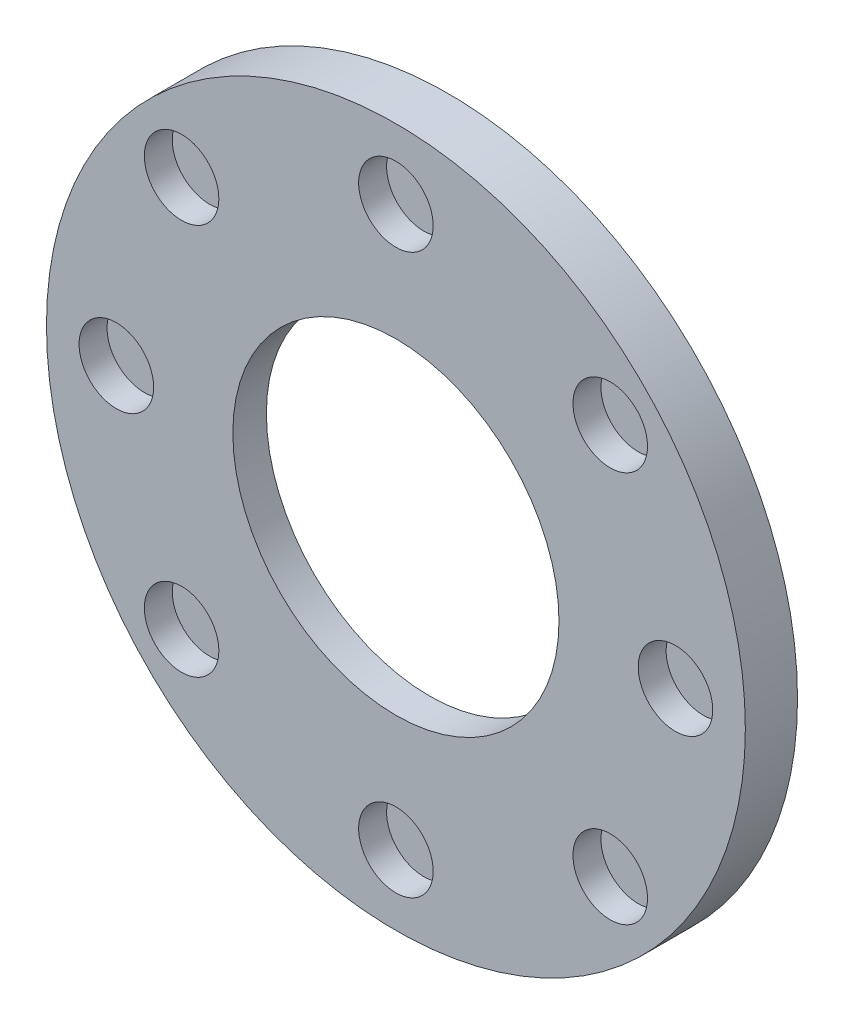
ISO-10303-21;
HEADER;
FILE_DESCRIPTION(('STEP AP214'),'2;1');
FILE_NAME('part.step','',(''),(''),'','','');
FILE_SCHEMA(('AUTOMOTIVE_DESIGN { 1 0 10303 214 1 1 1 1 }'));
ENDSEC;
DATA;
#1=APPLICATION_CONTEXT('core data for automotive mechanical design processes');
#2=APPLICATION_PROTOCOL_DEFINITION('international standard','automotive_design',2000,#1);
#3=PRODUCT_CONTEXT('',#1,'mechanical');
#4=PRODUCT('Part','Part','',(#3));
#5=PRODUCT_RELATED_PRODUCT_CATEGORY('part','',(#4));
#6=PRODUCT_DEFINITION_FORMATION('','',#4);
#7=PRODUCT_DEFINITION_CONTEXT('part definition',#1,'design');
#8=PRODUCT_DEFINITION('design','',#6,#7);
#9=PRODUCT_DEFINITION_SHAPE('','',#8);
#10=(LENGTH_UNIT() NAMED_UNIT(*) SI_UNIT(.MILLI.,.METRE.));
#11=(NAMED_UNIT(*) PLANE_ANGLE_UNIT() SI_UNIT($,.RADIAN.));
#12=(NAMED_UNIT(*) SI_UNIT($,.STERADIAN.) SOLID_ANGLE_UNIT());
#13=UNCERTAINTY_MEASURE_WITH_UNIT(LENGTH_MEASURE(1.E-05),#10,'distance_accuracy_value','');
#14=(GEOMETRIC_REPRESENTATION_CONTEXT(3) GLOBAL_UNCERTAINTY_ASSIGNED_CONTEXT((#13)) GLOBAL_UNIT_ASSIGNED_CONTEXT((#10,
#11,#12)) REPRESENTATION_CONTEXT('',''));
#15=CARTESIAN_POINT('',(0.,0.,0.));
#16=DIRECTION('',(0.,0.,1.));
#17=DIRECTION('',(1.,0.,0.));
#18=AXIS2_PLACEMENT_3D('',#15,#16,#17);
#19=CARTESIAN_POINT('',(0.,0.,0.));
#20=DIRECTION('',(0.,0.,1.));
#21=DIRECTION('',(1.,0.,0.));
#22=AXIS2_PLACEMENT_3D('',#19,#20,#21);
#23=PLANE('',#22);
#24=CARTESIAN_POINT('',(0.,0.,0.));
#25=DIRECTION('',(0.,0.,1.));
#26=DIRECTION('',(1.,0.,0.));
#27=AXIS2_PLACEMENT_3D('',#24,#25,#26);
#28=CIRCLE('',#27,37.5);
#29=CARTESIAN_POINT('',(37.5,0.,0.));
#30=VERTEX_POINT('',#29);
#31=EDGE_CURVE('E10',#30,#30,#28,.T.);
#32=ORIENTED_EDGE('',*,*,#31,.F.);
#33=EDGE_LOOP('',(#32));
#34=FACE_BOUND('',#33,.T.);
#35=CARTESIAN_POINT('',(0.,0.,0.));
#36=DIRECTION('',(0.,0.,1.));
#37=DIRECTION('',(1.,0.,0.));
#38=AXIS2_PLACEMENT_3D('',#35,#36,#37);
#39=CIRCLE('',#38,25.);
#40=CARTESIAN_POINT('',(25.,0.,0.));
#41=VERTEX_POINT('',#40);
#42=EDGE_CURVE('E38',#41,#41,#39,.T.);
#43=ORIENTED_EDGE('',*,*,#42,.T.);
#44=EDGE_LOOP('',(#43));
#45=FACE_BOUND('',#44,.T.);
#46=ADVANCED_FACE('F31',(#34,#45),#23,.F.);
#47=CARTESIAN_POINT('',(0.,0.,2.));
#48=DIRECTION('',(0.,0.,-1.));
#49=DIRECTION('',(-1.,0.,0.));
#50=AXIS2_PLACEMENT_3D('',#47,#48,#49);
#51=CYLINDRICAL_SURFACE('',#50,37.5);
#52=ORIENTED_EDGE('',*,*,#31,.T.);
#53=EDGE_LOOP('',(#52));
#54=FACE_BOUND('',#53,.T.);
#55=CARTESIAN_POINT('',(0.,0.,5.6));
#56=DIRECTION('',(0.,0.,1.));
#57=DIRECTION('',(1.,0.,0.));
#58=AXIS2_PLACEMENT_3D('',#55,#56,#57);
#59=CIRCLE('',#58,37.5);
#60=CARTESIAN_POINT('',(37.5,0.,5.6));
#61=VERTEX_POINT('',#60);
#62=EDGE_CURVE('E51',#61,#61,#59,.T.);
#63=ORIENTED_EDGE('',*,*,#62,.F.);
#64=EDGE_LOOP('',(#63));
#65=FACE_BOUND('',#64,.T.);
#66=ADVANCED_FACE('F33',(#54,#65),#51,.T.);
#67=CARTESIAN_POINT('',(0.,0.,2.));
#68=DIRECTION('',(0.,0.,-1.));
#69=DIRECTION('',(-1.,0.,0.));
#70=AXIS2_PLACEMENT_3D('',#67,#68,#69);
#71=CYLINDRICAL_SURFACE('',#70,25.);
#72=CARTESIAN_POINT('',(0.,0.,2.));
#73=DIRECTION('',(0.,0.,1.));
#74=DIRECTION('',(1.,0.,0.));
#75=AXIS2_PLACEMENT_3D('',#72,#73,#74);
#76=CIRCLE('',#75,25.);
#77=CARTESIAN_POINT('',(25.,0.,2.));
#78=VERTEX_POINT('',#77);
#79=EDGE_CURVE('E42',#78,#78,#76,.T.);
#80=ORIENTED_EDGE('',*,*,#79,.T.);
#81=EDGE_LOOP('',(#80));
#82=FACE_BOUND('',#81,.T.);
#83=ORIENTED_EDGE('',*,*,#42,.F.);
#84=EDGE_LOOP('',(#83));
#85=FACE_BOUND('',#84,.T.);
#86=ADVANCED_FACE('F132',(#82,#85),#71,.F.);
#87=CARTESIAN_POINT('',(0.,0.,2.));
#88=DIRECTION('',(0.,0.,1.));
#89=DIRECTION('',(1.,0.,0.));
#90=AXIS2_PLACEMENT_3D('',#87,#88,#89);
#91=PLANE('',#90);
#92=CARTESIAN_POINT('',(0.,0.,2.));
#93=DIRECTION('',(0.,0.,1.));
#94=DIRECTION('',(1.,0.,0.));
#95=AXIS2_PLACEMENT_3D('',#92,#93,#94);
#96=CIRCLE('',#95,17.5);
#97=CARTESIAN_POINT('',(17.5,0.,2.));
#98=VERTEX_POINT('',#97);
#99=EDGE_CURVE('E46',#98,#98,#96,.T.);
#100=ORIENTED_EDGE('',*,*,#99,.T.);
#101=EDGE_LOOP('',(#100));
#102=FACE_BOUND('',#101,.T.);
#103=ORIENTED_EDGE('',*,*,#79,.F.);
#104=EDGE_LOOP('',(#103));
#105=FACE_BOUND('',#104,.T.);
#106=ADVANCED_FACE('F122',(#102,#105),#91,.F.);
#107=CARTESIAN_POINT('',(0.,0.,2.6));
#108=DIRECTION('',(0.,0.,-1.));
#109=DIRECTION('',(-1.,0.,0.));
#110=AXIS2_PLACEMENT_3D('',#107,#108,#109);
#111=CYLINDRICAL_SURFACE('',#110,17.5);
#112=ORIENTED_EDGE('',*,*,#99,.F.);
#113=EDGE_LOOP('',(#112));
#114=FACE_BOUND('',#113,.T.);
#115=CARTESIAN_POINT('',(0.,0.,5.6));
#116=DIRECTION('',(0.,0.,1.));
#117=DIRECTION('',(1.,0.,0.));
#118=AXIS2_PLACEMENT_3D('',#115,#116,#117);
#119=CIRCLE('',#118,17.5);
#120=CARTESIAN_POINT('',(17.5,0.,5.6));
#121=VERTEX_POINT('',#120);
#122=EDGE_CURVE('E54',#121,#121,#119,.T.);
#123=ORIENTED_EDGE('',*,*,#122,.T.);
#124=EDGE_LOOP('',(#123));
#125=FACE_BOUND('',#124,.T.);
#126=ADVANCED_FACE('F112',(#114,#125),#111,.F.);
#127=CARTESIAN_POINT('',(0.,0.,5.6));
#128=DIRECTION('',(0.,0.,1.));
#129=DIRECTION('',(1.,0.,0.));
#130=AXIS2_PLACEMENT_3D('',#127,#128,#129);
#131=PLANE('',#130);
#132=CARTESIAN_POINT('',(-23.,-21.,5.6));
#133=DIRECTION('',(0.,0.,1.));
#134=DIRECTION('',(1.,0.,0.));
#135=AXIS2_PLACEMENT_3D('',#132,#133,#134);
#136=CIRCLE('',#135,4.);
#137=CARTESIAN_POINT('',(-19.,-21.,5.6));
#138=VERTEX_POINT('',#137);
#139=EDGE_CURVE('E91',#138,#138,#136,.T.);
#140=ORIENTED_EDGE('',*,*,#139,.F.);
#141=EDGE_LOOP('',(#140));
#142=FACE_BOUND('',#141,.T.);
#143=CARTESIAN_POINT('',(23.,21.,5.6));
#144=DIRECTION('',(0.,0.,1.));
#145=DIRECTION('',(1.,0.,0.));
#146=AXIS2_PLACEMENT_3D('',#143,#144,#145);
#147=CIRCLE('',#146,4.);
#148=CARTESIAN_POINT('',(27.,21.,5.6));
#149=VERTEX_POINT('',#148);
#150=EDGE_CURVE('E79',#149,#149,#147,.T.);
#151=ORIENTED_EDGE('',*,*,#150,.F.);
#152=EDGE_LOOP('',(#151));
#153=FACE_BOUND('',#152,.T.);
#154=CARTESIAN_POINT('',(30.,0.,5.6));
#155=DIRECTION('',(0.,0.,1.));
#156=DIRECTION('',(1.,0.,0.));
#157=AXIS2_PLACEMENT_3D('',#154,#155,#156);
#158=CIRCLE('',#157,4.);
#159=CARTESIAN_POINT('',(34.,0.,5.6));
#160=VERTEX_POINT('',#159);
#161=EDGE_CURVE('E67',#160,#160,#158,.T.);
#162=ORIENTED_EDGE('',*,*,#161,.F.);
#163=EDGE_LOOP('',(#162));
#164=FACE_BOUND('',#163,.T.);
#165=CARTESIAN_POINT('',(0.,30.,5.6));
#166=DIRECTION('',(0.,0.,1.));
#167=DIRECTION('',(1.,0.,0.));
#168=AXIS2_PLACEMENT_3D('',#165,#166,#167);
#169=CIRCLE('',#168,4.);
#170=CARTESIAN_POINT('',(4.,30.,5.6));
#171=VERTEX_POINT('',#170);
#172=EDGE_CURVE('E57',#171,#171,#169,.T.);
#173=ORIENTED_EDGE('',*,*,#172,.F.);
#174=EDGE_LOOP('',(#173));
#175=FACE_BOUND('',#174,.T.);
#176=ORIENTED_EDGE('',*,*,#62,.T.);
#177=EDGE_LOOP('',(#176));
#178=FACE_BOUND('',#177,.T.);
#179=ORIENTED_EDGE('',*,*,#122,.F.);
#180=EDGE_LOOP('',(#179));
#181=FACE_BOUND('',#180,.T.);
#182=CARTESIAN_POINT('',(0.,-30.,5.6));
#183=DIRECTION('',(0.,0.,1.));
#184=DIRECTION('',(1.,0.,0.));
#185=AXIS2_PLACEMENT_3D('',#182,#183,#184);
#186=CIRCLE('',#185,4.);
#187=CARTESIAN_POINT('',(4.,-30.,5.6));
#188=VERTEX_POINT('',#187);
#189=EDGE_CURVE('E61',#188,#188,#186,.T.);
#190=ORIENTED_EDGE('',*,*,#189,.F.);
#191=EDGE_LOOP('',(#190));
#192=FACE_BOUND('',#191,.T.);
#193=CARTESIAN_POINT('',(-30.,0.,5.6));
#194=DIRECTION('',(0.,0.,1.));
#195=DIRECTION('',(1.,0.,0.));
#196=AXIS2_PLACEMENT_3D('',#193,#194,#195);
#197=CIRCLE('',#196,4.);
#198=CARTESIAN_POINT('',(-26.,0.,5.6));
#199=VERTEX_POINT('',#198);
#200=EDGE_CURVE('E73',#199,#199,#197,.T.);
#201=ORIENTED_EDGE('',*,*,#200,.F.);
#202=EDGE_LOOP('',(#201));
#203=FACE_BOUND('',#202,.T.);
#204=CARTESIAN_POINT('',(-23.,21.,5.6));
#205=DIRECTION('',(0.,0.,1.));
#206=DIRECTION('',(1.,0.,0.));
#207=AXIS2_PLACEMENT_3D('',#204,#205,#206);
#208=CIRCLE('',#207,4.);
#209=CARTESIAN_POINT('',(-19.,21.,5.6));
#210=VERTEX_POINT('',#209);
#211=EDGE_CURVE('E85',#210,#210,#208,.T.);
#212=ORIENTED_EDGE('',*,*,#211,.F.);
#213=EDGE_LOOP('',(#212));
#214=FACE_BOUND('',#213,.T.);
#215=CARTESIAN_POINT('',(23.,-21.,5.6));
#216=DIRECTION('',(0.,0.,1.));
#217=DIRECTION('',(1.,0.,0.));
#218=AXIS2_PLACEMENT_3D('',#215,#216,#217);
#219=CIRCLE('',#218,4.);
#220=CARTESIAN_POINT('',(27.,-21.,5.6));
#221=VERTEX_POINT('',#220);
#222=EDGE_CURVE('E97',#221,#221,#219,.T.);
#223=ORIENTED_EDGE('',*,*,#222,.F.);
#224=EDGE_LOOP('',(#223));
#225=FACE_BOUND('',#224,.T.);
#226=ADVANCED_FACE('F109',(#142,#153,#164,#175,#178,#181,#192,#203,#214,#225),#131,.T.);
#227=CARTESIAN_POINT('',(0.,30.,5.6));
#228=DIRECTION('',(0.,0.,-1.));
#229=DIRECTION('',(-1.,0.,0.));
#230=AXIS2_PLACEMENT_3D('',#227,#228,#229);
#231=CYLINDRICAL_SURFACE('',#230,4.);
#232=ORIENTED_EDGE('',*,*,#172,.T.);
#233=EDGE_LOOP('',(#232));
#234=FACE_BOUND('',#233,.T.);
#235=CARTESIAN_POINT('',(0.,30.,2.6));
#236=DIRECTION('',(0.,0.,1.));
#237=DIRECTION('',(1.,0.,0.));
#238=AXIS2_PLACEMENT_3D('',#235,#236,#237);
#239=CIRCLE('',#238,4.);
#240=CARTESIAN_POINT('',(4.,30.,2.6));
#241=VERTEX_POINT('',#240);
#242=EDGE_CURVE('E58',#241,#241,#239,.T.);
#243=ORIENTED_EDGE('',*,*,#242,.F.);
#244=EDGE_LOOP('',(#243));
#245=FACE_BOUND('',#244,.T.);
#246=ADVANCED_FACE('F111',(#234,#245),#231,.F.);
#247=CARTESIAN_POINT('',(0.,-30.,5.6));
#248=DIRECTION('',(0.,0.,-1.));
#249=DIRECTION('',(-1.,0.,0.));
#250=AXIS2_PLACEMENT_3D('',#247,#248,#249);
#251=CYLINDRICAL_SURFACE('',#250,4.);
#252=ORIENTED_EDGE('',*,*,#189,.T.);
#253=EDGE_LOOP('',(#252));
#254=FACE_BOUND('',#253,.T.);
#255=CARTESIAN_POINT('',(0.,-30.,2.6));
#256=DIRECTION('',(0.,0.,1.));
#257=DIRECTION('',(1.,0.,0.));
#258=AXIS2_PLACEMENT_3D('',#255,#256,#257);
#259=CIRCLE('',#258,4.);
#260=CARTESIAN_POINT('',(4.,-30.,2.6));
#261=VERTEX_POINT('',#260);
#262=EDGE_CURVE('E64',#261,#261,#259,.T.);
#263=ORIENTED_EDGE('',*,*,#262,.F.);
#264=EDGE_LOOP('',(#263));
#265=FACE_BOUND('',#264,.T.);
#266=ADVANCED_FACE('F119',(#254,#265),#251,.F.);
#267=CARTESIAN_POINT('',(30.,0.,5.6));
#268=DIRECTION('',(0.,0.,-1.));
#269=DIRECTION('',(-1.,0.,0.));
#270=AXIS2_PLACEMENT_3D('',#267,#268,#269);
#271=CYLINDRICAL_SURFACE('',#270,4.);
#272=ORIENTED_EDGE('',*,*,#161,.T.);
#273=EDGE_LOOP('',(#272));
#274=FACE_BOUND('',#273,.T.);
#275=CARTESIAN_POINT('',(30.,0.,2.6));
#276=DIRECTION('',(0.,0.,1.));
#277=DIRECTION('',(1.,0.,0.));
#278=AXIS2_PLACEMENT_3D('',#275,#276,#277);
#279=CIRCLE('',#278,4.);
#280=CARTESIAN_POINT('',(34.,0.,2.6));
#281=VERTEX_POINT('',#280);
#282=EDGE_CURVE('E70',#281,#281,#279,.T.);
#283=ORIENTED_EDGE('',*,*,#282,.F.);
#284=EDGE_LOOP('',(#283));
#285=FACE_BOUND('',#284,.T.);
#286=ADVANCED_FACE('F163',(#274,#285),#271,.F.);
#287=CARTESIAN_POINT('',(-30.,0.,5.6));
#288=DIRECTION('',(0.,0.,-1.));
#289=DIRECTION('',(-1.,0.,0.));
#290=AXIS2_PLACEMENT_3D('',#287,#288,#289);
#291=CYLINDRICAL_SURFACE('',#290,4.);
#292=ORIENTED_EDGE('',*,*,#200,.T.);
#293=EDGE_LOOP('',(#292));
#294=FACE_BOUND('',#293,.T.);
#295=CARTESIAN_POINT('',(-30.,0.,2.6));
#296=DIRECTION('',(0.,0.,1.));
#297=DIRECTION('',(1.,0.,0.));
#298=AXIS2_PLACEMENT_3D('',#295,#296,#297);
#299=CIRCLE('',#298,4.);
#300=CARTESIAN_POINT('',(-26.,0.,2.6));
#301=VERTEX_POINT('',#300);
#302=EDGE_CURVE('E76',#301,#301,#299,.T.);
#303=ORIENTED_EDGE('',*,*,#302,.F.);
#304=EDGE_LOOP('',(#303));
#305=FACE_BOUND('',#304,.T.);
#306=ADVANCED_FACE('F169',(#294,#305),#291,.F.);
#307=CARTESIAN_POINT('',(23.,21.,5.6));
#308=DIRECTION('',(0.,0.,-1.));
#309=DIRECTION('',(-1.,0.,0.));
#310=AXIS2_PLACEMENT_3D('',#307,#308,#309);
#311=CYLINDRICAL_SURFACE('',#310,4.);
#312=ORIENTED_EDGE('',*,*,#150,.T.);
#313=EDGE_LOOP('',(#312));
#314=FACE_BOUND('',#313,.T.);
#315=CARTESIAN_POINT('',(23.,21.,2.6));
#316=DIRECTION('',(0.,0.,1.));
#317=DIRECTION('',(1.,0.,0.));
#318=AXIS2_PLACEMENT_3D('',#315,#316,#317);
#319=CIRCLE('',#318,4.);
#320=CARTESIAN_POINT('',(27.,21.,2.6));
#321=VERTEX_POINT('',#320);
#322=EDGE_CURVE('E82',#321,#321,#319,.T.);
#323=ORIENTED_EDGE('',*,*,#322,.F.);
#324=EDGE_LOOP('',(#323));
#325=FACE_BOUND('',#324,.T.);
#326=ADVANCED_FACE('F175',(#314,#325),#311,.F.);
#327=CARTESIAN_POINT('',(-23.,21.,5.6));
#328=DIRECTION('',(0.,0.,-1.));
#329=DIRECTION('',(-1.,0.,0.));
#330=AXIS2_PLACEMENT_3D('',#327,#328,#329);
#331=CYLINDRICAL_SURFACE('',#330,4.);
#332=ORIENTED_EDGE('',*,*,#211,.T.);
#333=EDGE_LOOP('',(#332));
#334=FACE_BOUND('',#333,.T.);
#335=CARTESIAN_POINT('',(-23.,21.,2.6));
#336=DIRECTION('',(0.,0.,1.));
#337=DIRECTION('',(1.,0.,0.));
#338=AXIS2_PLACEMENT_3D('',#335,#336,#337);
#339=CIRCLE('',#338,4.);
#340=CARTESIAN_POINT('',(-19.,21.,2.6));
#341=VERTEX_POINT('',#340);
#342=EDGE_CURVE('E88',#341,#341,#339,.T.);
#343=ORIENTED_EDGE('',*,*,#342,.F.);
#344=EDGE_LOOP('',(#343));
#345=FACE_BOUND('',#344,.T.);
#346=ADVANCED_FACE('F179',(#334,#345),#331,.F.);
#347=CARTESIAN_POINT('',(-23.,-21.,5.6));
#348=DIRECTION('',(0.,0.,-1.));
#349=DIRECTION('',(-1.,0.,0.));
#350=AXIS2_PLACEMENT_3D('',#347,#348,#349);
#351=CYLINDRICAL_SURFACE('',#350,4.);
#352=ORIENTED_EDGE('',*,*,#139,.T.);
#353=EDGE_LOOP('',(#352));
#354=FACE_BOUND('',#353,.T.);
#355=CARTESIAN_POINT('',(-23.,-21.,2.6));
#356=DIRECTION('',(0.,0.,1.));
#357=DIRECTION('',(1.,0.,0.));
#358=AXIS2_PLACEMENT_3D('',#355,#356,#357);
#359=CIRCLE('',#358,4.);
#360=CARTESIAN_POINT('',(-19.,-21.,2.6));
#361=VERTEX_POINT('',#360);
#362=EDGE_CURVE('E94',#361,#361,#359,.T.);
#363=ORIENTED_EDGE('',*,*,#362,.F.);
#364=EDGE_LOOP('',(#363));
#365=FACE_BOUND('',#364,.T.);
#366=ADVANCED_FACE('F183',(#354,#365),#351,.F.);
#367=CARTESIAN_POINT('',(23.,-21.,5.6));
#368=DIRECTION('',(0.,0.,-1.));
#369=DIRECTION('',(-1.,0.,0.));
#370=AXIS2_PLACEMENT_3D('',#367,#368,#369);
#371=CYLINDRICAL_SURFACE('',#370,4.);
#372=ORIENTED_EDGE('',*,*,#222,.T.);
#373=EDGE_LOOP('',(#372));
#374=FACE_BOUND('',#373,.T.);
#375=CARTESIAN_POINT('',(23.,-21.,2.6));
#376=DIRECTION('',(0.,0.,1.));
#377=DIRECTION('',(1.,0.,0.));
#378=AXIS2_PLACEMENT_3D('',#375,#376,#377);
#379=CIRCLE('',#378,4.);
#380=CARTESIAN_POINT('',(27.,-21.,2.6));
#381=VERTEX_POINT('',#380);
#382=EDGE_CURVE('E100',#381,#381,#379,.T.);
#383=ORIENTED_EDGE('',*,*,#382,.F.);
#384=EDGE_LOOP('',(#383));
#385=FACE_BOUND('',#384,.T.);
#386=ADVANCED_FACE('F106',(#374,#385),#371,.F.);
#387=CARTESIAN_POINT('',(0.,0.,2.6));
#388=DIRECTION('',(0.,0.,1.));
#389=DIRECTION('',(1.,0.,0.));
#390=AXIS2_PLACEMENT_3D('',#387,#388,#389);
#391=PLANE('',#390);
#392=ORIENTED_EDGE('',*,*,#362,.T.);
#393=EDGE_LOOP('',(#392));
#394=FACE_BOUND('',#393,.T.);
#395=ADVANCED_FACE('F150',(#394),#391,.T.);
#396=ORIENTED_EDGE('',*,*,#342,.T.);
#397=EDGE_LOOP('',(#396));
#398=FACE_BOUND('',#397,.T.);
#399=ADVANCED_FACE('F192',(#398),#391,.T.);
#400=ORIENTED_EDGE('',*,*,#322,.T.);
#401=EDGE_LOOP('',(#400));
#402=FACE_BOUND('',#401,.T.);
#403=ADVANCED_FACE('F197',(#402),#391,.T.);
#404=ORIENTED_EDGE('',*,*,#302,.T.);
#405=EDGE_LOOP('',(#404));
#406=FACE_BOUND('',#405,.T.);
#407=ADVANCED_FACE('F158',(#406),#391,.T.);
#408=ORIENTED_EDGE('',*,*,#282,.T.);
#409=EDGE_LOOP('',(#408));
#410=FACE_BOUND('',#409,.T.);
#411=ADVANCED_FACE('F151',(#410),#391,.T.);
#412=ORIENTED_EDGE('',*,*,#262,.T.);
#413=EDGE_LOOP('',(#412));
#414=FACE_BOUND('',#413,.T.);
#415=ADVANCED_FACE('F143',(#414),#391,.T.);
#416=ORIENTED_EDGE('',*,*,#242,.T.);
#417=EDGE_LOOP('',(#416));
#418=FACE_BOUND('',#417,.T.);
#419=ADVANCED_FACE('F140',(#418),#391,.T.);
#420=ORIENTED_EDGE('',*,*,#382,.T.);
#421=EDGE_LOOP('',(#420));
#422=FACE_BOUND('',#421,.T.);
#423=ADVANCED_FACE('F142',(#422),#391,.T.);
#424=CLOSED_SHELL('',(#46,#66,#86,#106,#126,#226,#246,#266,#286,#306,#326,#346,#366,#386,#395,
#399,#403,#407,#411,#415,#419,#423));
#425=MANIFOLD_SOLID_BREP('B2',#424);
#426=ADVANCED_BREP_SHAPE_REPRESENTATION('',(#18,#425),#14);
#427=SHAPE_DEFINITION_REPRESENTATION(#9,#426);
ENDSEC;
END-ISO-10303-21;
